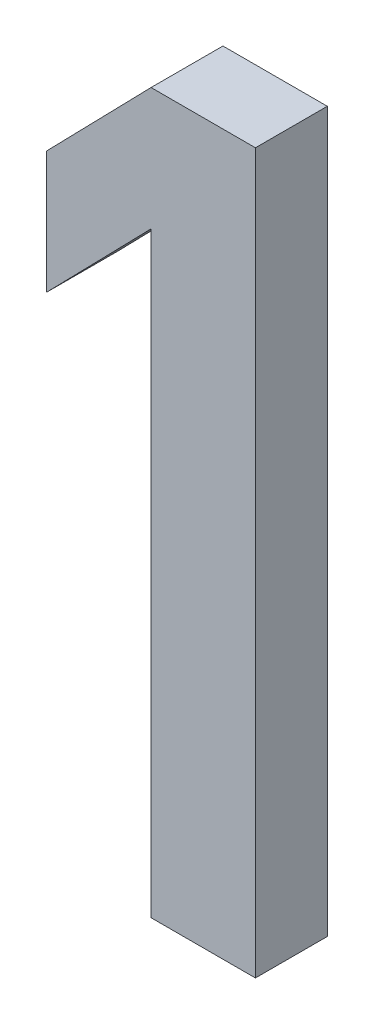
ISO-10303-21;
HEADER;
FILE_DESCRIPTION(('STEP AP214'),'2;1');
FILE_NAME('part.step','',(''),(''),'','','');
FILE_SCHEMA(('AUTOMOTIVE_DESIGN { 1 0 10303 214 1 1 1 1 }'));
ENDSEC;
DATA;
#1=APPLICATION_CONTEXT('core data for automotive mechanical design processes');
#2=APPLICATION_PROTOCOL_DEFINITION('international standard','automotive_design',2000,#1);
#3=PRODUCT_CONTEXT('',#1,'mechanical');
#4=PRODUCT('Part','Part','',(#3));
#5=PRODUCT_RELATED_PRODUCT_CATEGORY('part','',(#4));
#6=PRODUCT_DEFINITION_FORMATION('','',#4);
#7=PRODUCT_DEFINITION_CONTEXT('part definition',#1,'design');
#8=PRODUCT_DEFINITION('design','',#6,#7);
#9=PRODUCT_DEFINITION_SHAPE('','',#8);
#10=(LENGTH_UNIT() NAMED_UNIT(*) SI_UNIT(.MILLI.,.METRE.));
#11=(NAMED_UNIT(*) PLANE_ANGLE_UNIT() SI_UNIT($,.RADIAN.));
#12=(NAMED_UNIT(*) SI_UNIT($,.STERADIAN.) SOLID_ANGLE_UNIT());
#13=UNCERTAINTY_MEASURE_WITH_UNIT(LENGTH_MEASURE(1.E-05),#10,'distance_accuracy_value','');
#14=(GEOMETRIC_REPRESENTATION_CONTEXT(3) GLOBAL_UNCERTAINTY_ASSIGNED_CONTEXT((#13)) GLOBAL_UNIT_ASSIGNED_CONTEXT((#10,
#11,#12)) REPRESENTATION_CONTEXT('',''));
#15=CARTESIAN_POINT('',(0.,0.,0.));
#16=DIRECTION('',(0.,0.,1.));
#17=DIRECTION('',(1.,0.,0.));
#18=AXIS2_PLACEMENT_3D('',#15,#16,#17);
#19=CARTESIAN_POINT('',(0.,0.,-19.8));
#20=DIRECTION('',(0.,0.,1.));
#21=DIRECTION('',(1.,0.,0.));
#22=AXIS2_PLACEMENT_3D('',#19,#20,#21);
#23=PLANE('',#22);
#24=DIRECTION('',(0.,1.,0.));
#25=VECTOR('',#24,1.);
#26=CARTESIAN_POINT('',(-24.51935483871,3.2,-19.8));
#27=LINE('',#26,#25);
#28=CARTESIAN_POINT('',(-24.51935483871,3.2,-19.8));
#29=VERTEX_POINT('',#28);
#30=CARTESIAN_POINT('',(-24.51935483871,5.2,-19.8));
#31=VERTEX_POINT('',#30);
#32=EDGE_CURVE('E11',#29,#31,#27,.T.);
#33=ORIENTED_EDGE('',*,*,#32,.T.);
#34=DIRECTION('',(-1.,0.,0.));
#35=VECTOR('',#34,1.);
#36=CARTESIAN_POINT('',(-24.51935483871,5.2,-19.8));
#37=LINE('',#36,#35);
#38=CARTESIAN_POINT('',(-24.80967741935,5.2,-19.8));
#39=VERTEX_POINT('',#38);
#40=EDGE_CURVE('E24',#31,#39,#37,.T.);
#41=ORIENTED_EDGE('',*,*,#40,.T.);
#42=DIRECTION('',(-0.697973281203588,-0.716123801256388,0.));
#43=VECTOR('',#42,1.);
#44=CARTESIAN_POINT('',(-24.80967741935,5.2,-19.8));
#45=LINE('',#44,#43);
#46=CARTESIAN_POINT('',(-25.1,4.902127695084,-19.8));
#47=VERTEX_POINT('',#46);
#48=EDGE_CURVE('E127',#39,#47,#45,.T.);
#49=ORIENTED_EDGE('',*,*,#48,.T.);
#50=DIRECTION('',(0.,-1.,0.));
#51=VECTOR('',#50,1.);
#52=CARTESIAN_POINT('',(-25.1,4.902127695084,-19.8));
#53=LINE('',#52,#51);
#54=CARTESIAN_POINT('',(-25.1,4.561702084541,-19.8));
#55=VERTEX_POINT('',#54);
#56=EDGE_CURVE('E125',#47,#55,#53,.T.);
#57=ORIENTED_EDGE('',*,*,#56,.T.);
#58=DIRECTION('',(0.6979731379535,0.716123940875701,0.));
#59=VECTOR('',#58,1.);
#60=CARTESIAN_POINT('',(-25.1,4.561702084541,-19.8));
#61=LINE('',#60,#59);
#62=CARTESIAN_POINT('',(-24.80967741935,4.859574508667,-19.8));
#63=VERTEX_POINT('',#62);
#64=EDGE_CURVE('E123',#55,#63,#61,.T.);
#65=ORIENTED_EDGE('',*,*,#64,.T.);
#66=DIRECTION('',(0.,-1.,0.));
#67=VECTOR('',#66,1.);
#68=CARTESIAN_POINT('',(-24.80967741935,4.859574508667,-19.8));
#69=LINE('',#68,#67);
#70=CARTESIAN_POINT('',(-24.80967741935,3.2,-19.8));
#71=VERTEX_POINT('',#70);
#72=EDGE_CURVE('E121',#63,#71,#69,.T.);
#73=ORIENTED_EDGE('',*,*,#72,.T.);
#74=DIRECTION('',(1.,0.,0.));
#75=VECTOR('',#74,1.);
#76=CARTESIAN_POINT('',(-24.80967741935,3.2,-19.8));
#77=LINE('',#76,#75);
#78=EDGE_CURVE('E90',#71,#29,#77,.T.);
#79=ORIENTED_EDGE('',*,*,#78,.T.);
#80=EDGE_LOOP('',(#33,#41,#49,#57,#65,#73,#79));
#81=FACE_BOUND('',#80,.T.);
#82=ADVANCED_FACE('F17',(#81),#23,.T.);
#83=CARTESIAN_POINT('',(-24.51935483871,3.2,-20.));
#84=DIRECTION('',(1.,0.,0.));
#85=DIRECTION('',(0.,1.,0.));
#86=AXIS2_PLACEMENT_3D('',#83,#84,#85);
#87=PLANE('',#86);
#88=DIRECTION('',(0.,1.,0.));
#89=VECTOR('',#88,1.);
#90=CARTESIAN_POINT('',(-24.51935483871,3.2,-20.));
#91=LINE('',#90,#89);
#92=CARTESIAN_POINT('',(-24.51935483871,3.2,-20.));
#93=VERTEX_POINT('',#92);
#94=CARTESIAN_POINT('',(-24.51935483871,5.2,-20.));
#95=VERTEX_POINT('',#94);
#96=EDGE_CURVE('E94',#93,#95,#91,.T.);
#97=ORIENTED_EDGE('',*,*,#96,.T.);
#98=DIRECTION('',(0.,0.,1.));
#99=VECTOR('',#98,1.);
#100=CARTESIAN_POINT('',(-24.51935483871,5.2,-20.));
#101=LINE('',#100,#99);
#102=EDGE_CURVE('E117',#95,#31,#101,.T.);
#103=ORIENTED_EDGE('',*,*,#102,.T.);
#104=ORIENTED_EDGE('',*,*,#32,.F.);
#105=DIRECTION('',(0.,0.,1.));
#106=VECTOR('',#105,1.);
#107=CARTESIAN_POINT('',(-24.51935483871,3.2,-20.));
#108=LINE('',#107,#106);
#109=EDGE_CURVE('E115',#93,#29,#108,.T.);
#110=ORIENTED_EDGE('',*,*,#109,.F.);
#111=EDGE_LOOP('',(#97,#103,#104,#110));
#112=FACE_BOUND('',#111,.T.);
#113=ADVANCED_FACE('F155',(#112),#87,.T.);
#114=CARTESIAN_POINT('',(-24.51935483871,5.2,-20.));
#115=DIRECTION('',(0.,1.,0.));
#116=DIRECTION('',(-1.,0.,0.));
#117=AXIS2_PLACEMENT_3D('',#114,#115,#116);
#118=PLANE('',#117);
#119=DIRECTION('',(-1.,0.,0.));
#120=VECTOR('',#119,1.);
#121=CARTESIAN_POINT('',(-24.51935483871,5.2,-20.));
#122=LINE('',#121,#120);
#123=CARTESIAN_POINT('',(-24.80967741935,5.2,-20.));
#124=VERTEX_POINT('',#123);
#125=EDGE_CURVE('E113',#95,#124,#122,.T.);
#126=ORIENTED_EDGE('',*,*,#125,.T.);
#127=DIRECTION('',(0.,0.,1.));
#128=VECTOR('',#127,1.);
#129=CARTESIAN_POINT('',(-24.80967741935,5.2,-20.));
#130=LINE('',#129,#128);
#131=EDGE_CURVE('E110',#124,#39,#130,.T.);
#132=ORIENTED_EDGE('',*,*,#131,.T.);
#133=ORIENTED_EDGE('',*,*,#40,.F.);
#134=ORIENTED_EDGE('',*,*,#102,.F.);
#135=EDGE_LOOP('',(#126,#132,#133,#134));
#136=FACE_BOUND('',#135,.T.);
#137=ADVANCED_FACE('F137',(#136),#118,.T.);
#138=CARTESIAN_POINT('',(-24.80967741935,5.2,-20.));
#139=DIRECTION('',(-0.716123801256387,0.697973281203588,0.));
#140=DIRECTION('',(-0.697973281203588,-0.716123801256387,0.));
#141=AXIS2_PLACEMENT_3D('',#138,#139,#140);
#142=PLANE('',#141);
#143=DIRECTION('',(-0.697973281203588,-0.716123801256388,0.));
#144=VECTOR('',#143,1.);
#145=CARTESIAN_POINT('',(-24.80967741935,5.2,-20.));
#146=LINE('',#145,#144);
#147=CARTESIAN_POINT('',(-25.1,4.902127695084,-20.));
#148=VERTEX_POINT('',#147);
#149=EDGE_CURVE('E108',#124,#148,#146,.T.);
#150=ORIENTED_EDGE('',*,*,#149,.T.);
#151=DIRECTION('',(0.,0.,1.));
#152=VECTOR('',#151,1.);
#153=CARTESIAN_POINT('',(-25.1,4.902127695084,-20.));
#154=LINE('',#153,#152);
#155=EDGE_CURVE('E105',#148,#47,#154,.T.);
#156=ORIENTED_EDGE('',*,*,#155,.T.);
#157=ORIENTED_EDGE('',*,*,#48,.F.);
#158=ORIENTED_EDGE('',*,*,#131,.F.);
#159=EDGE_LOOP('',(#150,#156,#157,#158));
#160=FACE_BOUND('',#159,.T.);
#161=ADVANCED_FACE('F134',(#160),#142,.T.);
#162=CARTESIAN_POINT('',(-25.1,4.902127695084,-20.));
#163=DIRECTION('',(-1.,0.,0.));
#164=DIRECTION('',(0.,-1.,0.));
#165=AXIS2_PLACEMENT_3D('',#162,#163,#164);
#166=PLANE('',#165);
#167=DIRECTION('',(0.,-1.,0.));
#168=VECTOR('',#167,1.);
#169=CARTESIAN_POINT('',(-25.1,4.902127695084,-20.));
#170=LINE('',#169,#168);
#171=CARTESIAN_POINT('',(-25.1,4.561702084541,-20.));
#172=VERTEX_POINT('',#171);
#173=EDGE_CURVE('E103',#148,#172,#170,.T.);
#174=ORIENTED_EDGE('',*,*,#173,.T.);
#175=DIRECTION('',(0.,0.,1.));
#176=VECTOR('',#175,1.);
#177=CARTESIAN_POINT('',(-25.1,4.561702084541,-20.));
#178=LINE('',#177,#176);
#179=EDGE_CURVE('E100',#172,#55,#178,.T.);
#180=ORIENTED_EDGE('',*,*,#179,.T.);
#181=ORIENTED_EDGE('',*,*,#56,.F.);
#182=ORIENTED_EDGE('',*,*,#155,.F.);
#183=EDGE_LOOP('',(#174,#180,#181,#182));
#184=FACE_BOUND('',#183,.T.);
#185=ADVANCED_FACE('F140',(#184),#166,.T.);
#186=CARTESIAN_POINT('',(-25.1,4.561702084541,-20.));
#187=DIRECTION('',(0.716123940875701,-0.697973137953501,0.));
#188=DIRECTION('',(0.697973137953501,0.716123940875701,0.));
#189=AXIS2_PLACEMENT_3D('',#186,#187,#188);
#190=PLANE('',#189);
#191=DIRECTION('',(0.6979731379535,0.716123940875701,0.));
#192=VECTOR('',#191,1.);
#193=CARTESIAN_POINT('',(-25.1,4.561702084541,-20.));
#194=LINE('',#193,#192);
#195=CARTESIAN_POINT('',(-24.80967741935,4.859574508667,-20.));
#196=VERTEX_POINT('',#195);
#197=EDGE_CURVE('E98',#172,#196,#194,.T.);
#198=ORIENTED_EDGE('',*,*,#197,.T.);
#199=DIRECTION('',(0.,0.,1.));
#200=VECTOR('',#199,1.);
#201=CARTESIAN_POINT('',(-24.80967741935,4.859574508667,-20.));
#202=LINE('',#201,#200);
#203=EDGE_CURVE('E79',#196,#63,#202,.T.);
#204=ORIENTED_EDGE('',*,*,#203,.T.);
#205=ORIENTED_EDGE('',*,*,#64,.F.);
#206=ORIENTED_EDGE('',*,*,#179,.F.);
#207=EDGE_LOOP('',(#198,#204,#205,#206));
#208=FACE_BOUND('',#207,.T.);
#209=ADVANCED_FACE('F144',(#208),#190,.T.);
#210=CARTESIAN_POINT('',(-24.80967741935,4.859574508667,-20.));
#211=DIRECTION('',(-1.,0.,0.));
#212=DIRECTION('',(0.,-1.,0.));
#213=AXIS2_PLACEMENT_3D('',#210,#211,#212);
#214=PLANE('',#213);
#215=DIRECTION('',(0.,-1.,0.));
#216=VECTOR('',#215,1.);
#217=CARTESIAN_POINT('',(-24.80967741935,4.859574508667,-20.));
#218=LINE('',#217,#216);
#219=CARTESIAN_POINT('',(-24.80967741935,3.2,-20.));
#220=VERTEX_POINT('',#219);
#221=EDGE_CURVE('E73',#196,#220,#218,.T.);
#222=ORIENTED_EDGE('',*,*,#221,.T.);
#223=DIRECTION('',(0.,0.,1.));
#224=VECTOR('',#223,1.);
#225=CARTESIAN_POINT('',(-24.80967741935,3.2,-20.));
#226=LINE('',#225,#224);
#227=EDGE_CURVE('E77',#220,#71,#226,.T.);
#228=ORIENTED_EDGE('',*,*,#227,.T.);
#229=ORIENTED_EDGE('',*,*,#72,.F.);
#230=ORIENTED_EDGE('',*,*,#203,.F.);
#231=EDGE_LOOP('',(#222,#228,#229,#230));
#232=FACE_BOUND('',#231,.T.);
#233=ADVANCED_FACE('F75',(#232),#214,.T.);
#234=CARTESIAN_POINT('',(-24.80967741935,3.2,-20.));
#235=DIRECTION('',(0.,-1.,0.));
#236=DIRECTION('',(1.,0.,0.));
#237=AXIS2_PLACEMENT_3D('',#234,#235,#236);
#238=PLANE('',#237);
#239=DIRECTION('',(1.,0.,0.));
#240=VECTOR('',#239,1.);
#241=CARTESIAN_POINT('',(-24.80967741935,3.2,-20.));
#242=LINE('',#241,#240);
#243=EDGE_CURVE('E89',#220,#93,#242,.T.);
#244=ORIENTED_EDGE('',*,*,#243,.T.);
#245=ORIENTED_EDGE('',*,*,#109,.T.);
#246=ORIENTED_EDGE('',*,*,#78,.F.);
#247=ORIENTED_EDGE('',*,*,#227,.F.);
#248=EDGE_LOOP('',(#244,#245,#246,#247));
#249=FACE_BOUND('',#248,.T.);
#250=ADVANCED_FACE('F87',(#249),#238,.T.);
#251=CARTESIAN_POINT('',(-1.04461879526,-0.712240098159247,-20.));
#252=DIRECTION('',(0.,0.,1.));
#253=DIRECTION('',(1.,0.,0.));
#254=AXIS2_PLACEMENT_3D('',#251,#252,#253);
#255=PLANE('',#254);
#256=ORIENTED_EDGE('',*,*,#243,.F.);
#257=ORIENTED_EDGE('',*,*,#221,.F.);
#258=ORIENTED_EDGE('',*,*,#197,.F.);
#259=ORIENTED_EDGE('',*,*,#173,.F.);
#260=ORIENTED_EDGE('',*,*,#149,.F.);
#261=ORIENTED_EDGE('',*,*,#125,.F.);
#262=ORIENTED_EDGE('',*,*,#96,.F.);
#263=EDGE_LOOP('',(#256,#257,#258,#259,#260,#261,#262));
#264=FACE_BOUND('',#263,.T.);
#265=ADVANCED_FACE('F92',(#264),#255,.F.);
#266=CLOSED_SHELL('',(#82,#113,#137,#161,#185,#209,#233,#250,#265));
#267=MANIFOLD_SOLID_BREP('B1',#266);
#268=ADVANCED_BREP_SHAPE_REPRESENTATION('',(#18,#267),#14);
#269=SHAPE_DEFINITION_REPRESENTATION(#9,#268);
ENDSEC;
END-ISO-10303-21;
